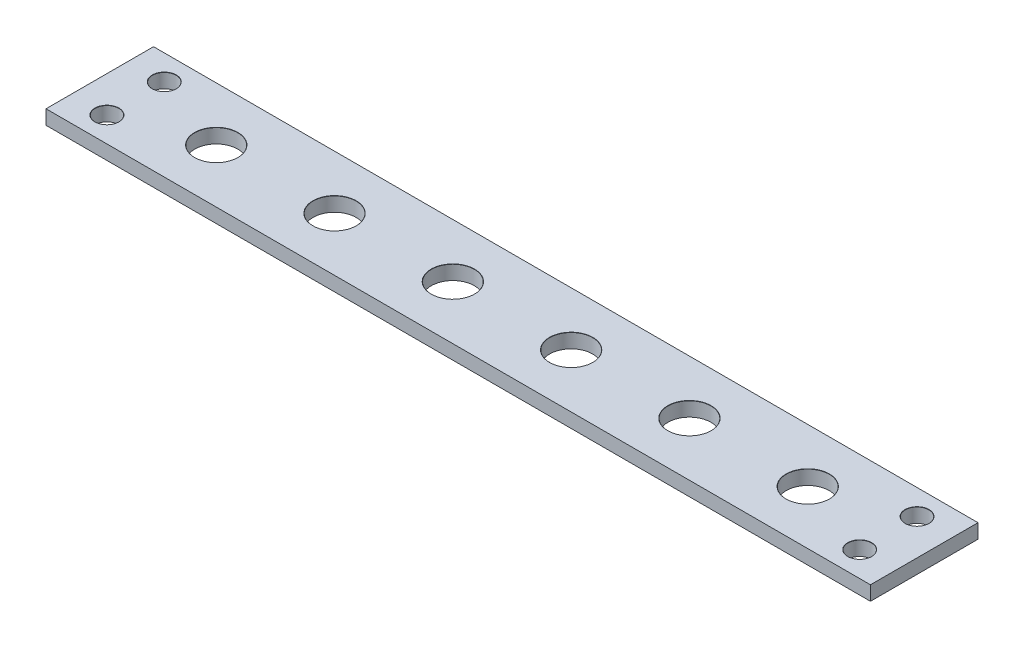
ISO-10303-21;
HEADER;
FILE_DESCRIPTION(('STEP AP214'),'2;1');
FILE_NAME('part.step','',(''),(''),'','','');
FILE_SCHEMA(('AUTOMOTIVE_DESIGN { 1 0 10303 214 1 1 1 1 }'));
ENDSEC;
DATA;
#1=APPLICATION_CONTEXT('core data for automotive mechanical design processes');
#2=APPLICATION_PROTOCOL_DEFINITION('international standard','automotive_design',2000,#1);
#3=PRODUCT_CONTEXT('',#1,'mechanical');
#4=PRODUCT('Part','Part','',(#3));
#5=PRODUCT_RELATED_PRODUCT_CATEGORY('part','',(#4));
#6=PRODUCT_DEFINITION_FORMATION('','',#4);
#7=PRODUCT_DEFINITION_CONTEXT('part definition',#1,'design');
#8=PRODUCT_DEFINITION('design','',#6,#7);
#9=PRODUCT_DEFINITION_SHAPE('','',#8);
#10=(LENGTH_UNIT() NAMED_UNIT(*) SI_UNIT(.MILLI.,.METRE.));
#11=(NAMED_UNIT(*) PLANE_ANGLE_UNIT() SI_UNIT($,.RADIAN.));
#12=(NAMED_UNIT(*) SI_UNIT($,.STERADIAN.) SOLID_ANGLE_UNIT());
#13=UNCERTAINTY_MEASURE_WITH_UNIT(LENGTH_MEASURE(1.E-05),#10,'distance_accuracy_value','');
#14=(GEOMETRIC_REPRESENTATION_CONTEXT(3) GLOBAL_UNCERTAINTY_ASSIGNED_CONTEXT((#13)) GLOBAL_UNIT_ASSIGNED_CONTEXT((#10,
#11,#12)) REPRESENTATION_CONTEXT('',''));
#15=CARTESIAN_POINT('',(0.,0.,0.));
#16=DIRECTION('',(0.,0.,1.));
#17=DIRECTION('',(1.,0.,0.));
#18=AXIS2_PLACEMENT_3D('',#15,#16,#17);
#19=CARTESIAN_POINT('',(57.5,2.,-7.5));
#20=DIRECTION('',(-1.,0.,0.));
#21=DIRECTION('',(0.,0.,1.));
#22=AXIS2_PLACEMENT_3D('',#19,#20,#21);
#23=PLANE('',#22);
#24=DIRECTION('',(0.,0.,-1.));
#25=VECTOR('',#24,1.);
#26=CARTESIAN_POINT('',(57.5,0.,-7.5));
#27=LINE('',#26,#25);
#28=CARTESIAN_POINT('',(57.5,0.,7.5));
#29=VERTEX_POINT('',#28);
#30=CARTESIAN_POINT('',(57.5,0.,-7.5));
#31=VERTEX_POINT('',#30);
#32=EDGE_CURVE('E98',#29,#31,#27,.T.);
#33=ORIENTED_EDGE('',*,*,#32,.T.);
#34=DIRECTION('',(0.,-1.,0.));
#35=VECTOR('',#34,1.);
#36=CARTESIAN_POINT('',(57.5,2.,-7.5));
#37=LINE('',#36,#35);
#38=CARTESIAN_POINT('',(57.5,2.,-7.5));
#39=VERTEX_POINT('',#38);
#40=EDGE_CURVE('E11',#39,#31,#37,.T.);
#41=ORIENTED_EDGE('',*,*,#40,.F.);
#42=DIRECTION('',(0.,0.,-1.));
#43=VECTOR('',#42,1.);
#44=CARTESIAN_POINT('',(57.5,2.,-7.5));
#45=LINE('',#44,#43);
#46=CARTESIAN_POINT('',(57.5,2.,7.5));
#47=VERTEX_POINT('',#46);
#48=EDGE_CURVE('E85',#47,#39,#45,.T.);
#49=ORIENTED_EDGE('',*,*,#48,.F.);
#50=DIRECTION('',(0.,-1.,0.));
#51=VECTOR('',#50,1.);
#52=CARTESIAN_POINT('',(57.5,2.,7.5));
#53=LINE('',#52,#51);
#54=EDGE_CURVE('E94',#47,#29,#53,.T.);
#55=ORIENTED_EDGE('',*,*,#54,.T.);
#56=EDGE_LOOP('',(#33,#41,#49,#55));
#57=FACE_BOUND('',#56,.T.);
#58=ADVANCED_FACE('F32',(#57),#23,.F.);
#59=CARTESIAN_POINT('',(-57.5,2.,-7.5));
#60=DIRECTION('',(0.,0.,1.));
#61=DIRECTION('',(1.,0.,0.));
#62=AXIS2_PLACEMENT_3D('',#59,#60,#61);
#63=PLANE('',#62);
#64=DIRECTION('',(-1.,0.,0.));
#65=VECTOR('',#64,1.);
#66=CARTESIAN_POINT('',(-57.5,0.,-7.5));
#67=LINE('',#66,#65);
#68=CARTESIAN_POINT('',(-57.5,0.,-7.5));
#69=VERTEX_POINT('',#68);
#70=EDGE_CURVE('E89',#31,#69,#67,.T.);
#71=ORIENTED_EDGE('',*,*,#70,.T.);
#72=DIRECTION('',(0.,-1.,0.));
#73=VECTOR('',#72,1.);
#74=CARTESIAN_POINT('',(-57.5,2.,-7.5));
#75=LINE('',#74,#73);
#76=CARTESIAN_POINT('',(-57.5,2.,-7.5));
#77=VERTEX_POINT('',#76);
#78=EDGE_CURVE('E41',#77,#69,#75,.T.);
#79=ORIENTED_EDGE('',*,*,#78,.F.);
#80=DIRECTION('',(-1.,0.,0.));
#81=VECTOR('',#80,1.);
#82=CARTESIAN_POINT('',(-57.5,2.,-7.5));
#83=LINE('',#82,#81);
#84=EDGE_CURVE('E80',#39,#77,#83,.T.);
#85=ORIENTED_EDGE('',*,*,#84,.F.);
#86=ORIENTED_EDGE('',*,*,#40,.T.);
#87=EDGE_LOOP('',(#71,#79,#85,#86));
#88=FACE_BOUND('',#87,.T.);
#89=ADVANCED_FACE('F88',(#88),#63,.F.);
#90=CARTESIAN_POINT('',(-57.5,2.,-7.5));
#91=DIRECTION('',(1.,0.,0.));
#92=DIRECTION('',(0.,0.,-1.));
#93=AXIS2_PLACEMENT_3D('',#90,#91,#92);
#94=PLANE('',#93);
#95=DIRECTION('',(0.,0.,1.));
#96=VECTOR('',#95,1.);
#97=CARTESIAN_POINT('',(-57.5,0.,-7.5));
#98=LINE('',#97,#96);
#99=CARTESIAN_POINT('',(-57.5,0.,7.5));
#100=VERTEX_POINT('',#99);
#101=EDGE_CURVE('E67',#69,#100,#98,.T.);
#102=ORIENTED_EDGE('',*,*,#101,.T.);
#103=DIRECTION('',(0.,-1.,0.));
#104=VECTOR('',#103,1.);
#105=CARTESIAN_POINT('',(-57.5,2.,7.5));
#106=LINE('',#105,#104);
#107=CARTESIAN_POINT('',(-57.5,2.,7.5));
#108=VERTEX_POINT('',#107);
#109=EDGE_CURVE('E90',#108,#100,#106,.T.);
#110=ORIENTED_EDGE('',*,*,#109,.F.);
#111=DIRECTION('',(0.,0.,1.));
#112=VECTOR('',#111,1.);
#113=CARTESIAN_POINT('',(-57.5,2.,-7.5));
#114=LINE('',#113,#112);
#115=EDGE_CURVE('E83',#77,#108,#114,.T.);
#116=ORIENTED_EDGE('',*,*,#115,.F.);
#117=ORIENTED_EDGE('',*,*,#78,.T.);
#118=EDGE_LOOP('',(#102,#110,#116,#117));
#119=FACE_BOUND('',#118,.T.);
#120=ADVANCED_FACE('F92',(#119),#94,.F.);
#121=CARTESIAN_POINT('',(-57.5,2.,7.5));
#122=DIRECTION('',(0.,0.,-1.));
#123=DIRECTION('',(-1.,0.,0.));
#124=AXIS2_PLACEMENT_3D('',#121,#122,#123);
#125=PLANE('',#124);
#126=DIRECTION('',(1.,0.,0.));
#127=VECTOR('',#126,1.);
#128=CARTESIAN_POINT('',(-57.5,0.,7.5));
#129=LINE('',#128,#127);
#130=EDGE_CURVE('E73',#100,#29,#129,.T.);
#131=ORIENTED_EDGE('',*,*,#130,.T.);
#132=ORIENTED_EDGE('',*,*,#54,.F.);
#133=DIRECTION('',(1.,0.,0.));
#134=VECTOR('',#133,1.);
#135=CARTESIAN_POINT('',(-57.5,2.,7.5));
#136=LINE('',#135,#134);
#137=EDGE_CURVE('E50',#108,#47,#136,.T.);
#138=ORIENTED_EDGE('',*,*,#137,.F.);
#139=ORIENTED_EDGE('',*,*,#109,.T.);
#140=EDGE_LOOP('',(#131,#132,#138,#139));
#141=FACE_BOUND('',#140,.T.);
#142=ADVANCED_FACE('F204',(#141),#125,.F.);
#143=CARTESIAN_POINT('',(0.,2.,0.));
#144=DIRECTION('',(0.,1.,0.));
#145=DIRECTION('',(0.,0.,1.));
#146=AXIS2_PLACEMENT_3D('',#143,#144,#145);
#147=PLANE('',#146);
#148=CARTESIAN_POINT('',(-8.25,2.,0.));
#149=DIRECTION('',(0.,1.,0.));
#150=DIRECTION('',(0.,0.,1.));
#151=AXIS2_PLACEMENT_3D('',#148,#149,#150);
#152=CIRCLE('',#151,3.025);
#153=CARTESIAN_POINT('',(-8.25,2.,3.025));
#154=VERTEX_POINT('',#153);
#155=EDGE_CURVE('E444',#154,#154,#152,.T.);
#156=ORIENTED_EDGE('',*,*,#155,.F.);
#157=EDGE_LOOP('',(#156));
#158=FACE_BOUND('',#157,.T.);
#159=CARTESIAN_POINT('',(8.25,2.,0.));
#160=DIRECTION('',(0.,1.,0.));
#161=DIRECTION('',(0.,0.,1.));
#162=AXIS2_PLACEMENT_3D('',#159,#160,#161);
#163=CIRCLE('',#162,3.025);
#164=CARTESIAN_POINT('',(8.25,2.,3.025));
#165=VERTEX_POINT('',#164);
#166=EDGE_CURVE('E153',#165,#165,#163,.T.);
#167=ORIENTED_EDGE('',*,*,#166,.F.);
#168=EDGE_LOOP('',(#167));
#169=FACE_BOUND('',#168,.T.);
#170=CARTESIAN_POINT('',(24.75,2.,0.));
#171=DIRECTION('',(0.,1.,0.));
#172=DIRECTION('',(0.,0.,1.));
#173=AXIS2_PLACEMENT_3D('',#170,#171,#172);
#174=CIRCLE('',#173,3.025);
#175=CARTESIAN_POINT('',(24.75,2.,3.025));
#176=VERTEX_POINT('',#175);
#177=EDGE_CURVE('E146',#176,#176,#174,.T.);
#178=ORIENTED_EDGE('',*,*,#177,.F.);
#179=EDGE_LOOP('',(#178));
#180=FACE_BOUND('',#179,.T.);
#181=CARTESIAN_POINT('',(41.25,2.,0.));
#182=DIRECTION('',(0.,1.,0.));
#183=DIRECTION('',(0.,0.,1.));
#184=AXIS2_PLACEMENT_3D('',#181,#182,#183);
#185=CIRCLE('',#184,3.025);
#186=CARTESIAN_POINT('',(41.25,2.,3.025));
#187=VERTEX_POINT('',#186);
#188=EDGE_CURVE('E142',#187,#187,#185,.T.);
#189=ORIENTED_EDGE('',*,*,#188,.F.);
#190=EDGE_LOOP('',(#189));
#191=FACE_BOUND('',#190,.T.);
#192=CARTESIAN_POINT('',(-24.75,2.,0.));
#193=DIRECTION('',(0.,1.,0.));
#194=DIRECTION('',(0.,0.,1.));
#195=AXIS2_PLACEMENT_3D('',#192,#193,#194);
#196=CIRCLE('',#195,3.025);
#197=CARTESIAN_POINT('',(-24.75,2.,3.02500000000001));
#198=VERTEX_POINT('',#197);
#199=EDGE_CURVE('E138',#198,#198,#196,.T.);
#200=ORIENTED_EDGE('',*,*,#199,.F.);
#201=EDGE_LOOP('',(#200));
#202=FACE_BOUND('',#201,.T.);
#203=CARTESIAN_POINT('',(-41.25,2.,0.));
#204=DIRECTION('',(0.,1.,0.));
#205=DIRECTION('',(0.,0.,1.));
#206=AXIS2_PLACEMENT_3D('',#203,#204,#205);
#207=CIRCLE('',#206,3.025);
#208=CARTESIAN_POINT('',(-41.25,2.,3.02500000000001));
#209=VERTEX_POINT('',#208);
#210=EDGE_CURVE('E133',#209,#209,#207,.T.);
#211=ORIENTED_EDGE('',*,*,#210,.F.);
#212=EDGE_LOOP('',(#211));
#213=FACE_BOUND('',#212,.T.);
#214=CARTESIAN_POINT('',(-52.5,2.,-4.));
#215=DIRECTION('',(0.,1.,0.));
#216=DIRECTION('',(0.,0.,1.));
#217=AXIS2_PLACEMENT_3D('',#214,#215,#216);
#218=CIRCLE('',#217,1.675);
#219=CARTESIAN_POINT('',(-52.5,2.,-2.325));
#220=VERTEX_POINT('',#219);
#221=EDGE_CURVE('E128',#220,#220,#218,.T.);
#222=ORIENTED_EDGE('',*,*,#221,.F.);
#223=EDGE_LOOP('',(#222));
#224=FACE_BOUND('',#223,.T.);
#225=CARTESIAN_POINT('',(-52.5,2.,4.));
#226=DIRECTION('',(0.,1.,0.));
#227=DIRECTION('',(0.,0.,1.));
#228=AXIS2_PLACEMENT_3D('',#225,#226,#227);
#229=CIRCLE('',#228,1.675);
#230=CARTESIAN_POINT('',(-52.5,2.,5.675));
#231=VERTEX_POINT('',#230);
#232=EDGE_CURVE('E123',#231,#231,#229,.T.);
#233=ORIENTED_EDGE('',*,*,#232,.F.);
#234=EDGE_LOOP('',(#233));
#235=FACE_BOUND('',#234,.T.);
#236=CARTESIAN_POINT('',(52.5,2.,-4.));
#237=DIRECTION('',(0.,1.,0.));
#238=DIRECTION('',(0.,0.,1.));
#239=AXIS2_PLACEMENT_3D('',#236,#237,#238);
#240=CIRCLE('',#239,1.675);
#241=CARTESIAN_POINT('',(52.5,2.,-2.325));
#242=VERTEX_POINT('',#241);
#243=EDGE_CURVE('E118',#242,#242,#240,.T.);
#244=ORIENTED_EDGE('',*,*,#243,.F.);
#245=EDGE_LOOP('',(#244));
#246=FACE_BOUND('',#245,.T.);
#247=CARTESIAN_POINT('',(52.5,2.,4.));
#248=DIRECTION('',(0.,1.,0.));
#249=DIRECTION('',(0.,0.,1.));
#250=AXIS2_PLACEMENT_3D('',#247,#248,#249);
#251=CIRCLE('',#250,1.675);
#252=CARTESIAN_POINT('',(52.5,2.,5.675));
#253=VERTEX_POINT('',#252);
#254=EDGE_CURVE('E113',#253,#253,#251,.T.);
#255=ORIENTED_EDGE('',*,*,#254,.F.);
#256=EDGE_LOOP('',(#255));
#257=FACE_BOUND('',#256,.T.);
#258=ORIENTED_EDGE('',*,*,#48,.T.);
#259=ORIENTED_EDGE('',*,*,#84,.T.);
#260=ORIENTED_EDGE('',*,*,#115,.T.);
#261=ORIENTED_EDGE('',*,*,#137,.T.);
#262=EDGE_LOOP('',(#258,#259,#260,#261));
#263=FACE_BOUND('',#262,.T.);
#264=ADVANCED_FACE('F81',(#158,#169,#180,#191,#202,#213,#224,#235,#246,#257,#263),#147,.T.);
#265=CARTESIAN_POINT('',(0.,0.,0.));
#266=DIRECTION('',(0.,1.,0.));
#267=DIRECTION('',(0.,0.,1.));
#268=AXIS2_PLACEMENT_3D('',#265,#266,#267);
#269=PLANE('',#268);
#270=CARTESIAN_POINT('',(-8.25,0.,0.));
#271=DIRECTION('',(0.,1.,0.));
#272=DIRECTION('',(0.,0.,1.));
#273=AXIS2_PLACEMENT_3D('',#270,#271,#272);
#274=CIRCLE('',#273,3.);
#275=CARTESIAN_POINT('',(-8.25,0.,3.));
#276=VERTEX_POINT('',#275);
#277=EDGE_CURVE('E35',#276,#276,#274,.T.);
#278=ORIENTED_EDGE('',*,*,#277,.T.);
#279=EDGE_LOOP('',(#278));
#280=FACE_BOUND('',#279,.T.);
#281=CARTESIAN_POINT('',(8.25,0.,0.));
#282=DIRECTION('',(0.,1.,0.));
#283=DIRECTION('',(0.,0.,1.));
#284=AXIS2_PLACEMENT_3D('',#281,#282,#283);
#285=CIRCLE('',#284,3.);
#286=CARTESIAN_POINT('',(8.25,0.,3.));
#287=VERTEX_POINT('',#286);
#288=EDGE_CURVE('E144',#287,#287,#285,.T.);
#289=ORIENTED_EDGE('',*,*,#288,.T.);
#290=EDGE_LOOP('',(#289));
#291=FACE_BOUND('',#290,.T.);
#292=CARTESIAN_POINT('',(24.75,0.,0.));
#293=DIRECTION('',(0.,1.,0.));
#294=DIRECTION('',(0.,0.,1.));
#295=AXIS2_PLACEMENT_3D('',#292,#293,#294);
#296=CIRCLE('',#295,3.);
#297=CARTESIAN_POINT('',(24.75,0.,3.));
#298=VERTEX_POINT('',#297);
#299=EDGE_CURVE('E140',#298,#298,#296,.T.);
#300=ORIENTED_EDGE('',*,*,#299,.T.);
#301=EDGE_LOOP('',(#300));
#302=FACE_BOUND('',#301,.T.);
#303=CARTESIAN_POINT('',(41.25,0.,0.));
#304=DIRECTION('',(0.,1.,0.));
#305=DIRECTION('',(0.,0.,1.));
#306=AXIS2_PLACEMENT_3D('',#303,#304,#305);
#307=CIRCLE('',#306,3.);
#308=CARTESIAN_POINT('',(41.25,0.,3.));
#309=VERTEX_POINT('',#308);
#310=EDGE_CURVE('E135',#309,#309,#307,.T.);
#311=ORIENTED_EDGE('',*,*,#310,.T.);
#312=EDGE_LOOP('',(#311));
#313=FACE_BOUND('',#312,.T.);
#314=CARTESIAN_POINT('',(-24.75,0.,0.));
#315=DIRECTION('',(0.,1.,0.));
#316=DIRECTION('',(0.,0.,1.));
#317=AXIS2_PLACEMENT_3D('',#314,#315,#316);
#318=CIRCLE('',#317,3.);
#319=CARTESIAN_POINT('',(-24.75,0.,3.));
#320=VERTEX_POINT('',#319);
#321=EDGE_CURVE('E130',#320,#320,#318,.T.);
#322=ORIENTED_EDGE('',*,*,#321,.T.);
#323=EDGE_LOOP('',(#322));
#324=FACE_BOUND('',#323,.T.);
#325=CARTESIAN_POINT('',(-41.25,0.,0.));
#326=DIRECTION('',(0.,1.,0.));
#327=DIRECTION('',(0.,0.,1.));
#328=AXIS2_PLACEMENT_3D('',#325,#326,#327);
#329=CIRCLE('',#328,3.);
#330=CARTESIAN_POINT('',(-41.25,0.,3.00000000000001));
#331=VERTEX_POINT('',#330);
#332=EDGE_CURVE('E125',#331,#331,#329,.T.);
#333=ORIENTED_EDGE('',*,*,#332,.T.);
#334=EDGE_LOOP('',(#333));
#335=FACE_BOUND('',#334,.T.);
#336=CARTESIAN_POINT('',(-52.5,0.,-4.));
#337=DIRECTION('',(0.,1.,0.));
#338=DIRECTION('',(0.,0.,1.));
#339=AXIS2_PLACEMENT_3D('',#336,#337,#338);
#340=CIRCLE('',#339,1.65);
#341=CARTESIAN_POINT('',(-52.5,0.,-2.35));
#342=VERTEX_POINT('',#341);
#343=EDGE_CURVE('E120',#342,#342,#340,.T.);
#344=ORIENTED_EDGE('',*,*,#343,.T.);
#345=EDGE_LOOP('',(#344));
#346=FACE_BOUND('',#345,.T.);
#347=CARTESIAN_POINT('',(-52.5,0.,4.));
#348=DIRECTION('',(0.,1.,0.));
#349=DIRECTION('',(0.,0.,1.));
#350=AXIS2_PLACEMENT_3D('',#347,#348,#349);
#351=CIRCLE('',#350,1.65);
#352=CARTESIAN_POINT('',(-52.5,0.,5.65));
#353=VERTEX_POINT('',#352);
#354=EDGE_CURVE('E115',#353,#353,#351,.T.);
#355=ORIENTED_EDGE('',*,*,#354,.T.);
#356=EDGE_LOOP('',(#355));
#357=FACE_BOUND('',#356,.T.);
#358=CARTESIAN_POINT('',(52.5,0.,-4.));
#359=DIRECTION('',(0.,1.,0.));
#360=DIRECTION('',(0.,0.,1.));
#361=AXIS2_PLACEMENT_3D('',#358,#359,#360);
#362=CIRCLE('',#361,1.65);
#363=CARTESIAN_POINT('',(52.5,0.,-2.35));
#364=VERTEX_POINT('',#363);
#365=EDGE_CURVE('E110',#364,#364,#362,.T.);
#366=ORIENTED_EDGE('',*,*,#365,.T.);
#367=EDGE_LOOP('',(#366));
#368=FACE_BOUND('',#367,.T.);
#369=CARTESIAN_POINT('',(52.5,0.,4.));
#370=DIRECTION('',(0.,1.,0.));
#371=DIRECTION('',(0.,0.,1.));
#372=AXIS2_PLACEMENT_3D('',#369,#370,#371);
#373=CIRCLE('',#372,1.65);
#374=CARTESIAN_POINT('',(52.5,0.,5.65));
#375=VERTEX_POINT('',#374);
#376=EDGE_CURVE('E101',#375,#375,#373,.T.);
#377=ORIENTED_EDGE('',*,*,#376,.T.);
#378=EDGE_LOOP('',(#377));
#379=FACE_BOUND('',#378,.T.);
#380=ORIENTED_EDGE('',*,*,#32,.F.);
#381=ORIENTED_EDGE('',*,*,#130,.F.);
#382=ORIENTED_EDGE('',*,*,#101,.F.);
#383=ORIENTED_EDGE('',*,*,#70,.F.);
#384=EDGE_LOOP('',(#380,#381,#382,#383));
#385=FACE_BOUND('',#384,.T.);
#386=ADVANCED_FACE('F203',(#280,#291,#302,#313,#324,#335,#346,#357,#368,#379,#385),#269,.F.);
#387=CARTESIAN_POINT('',(52.5,2.,4.));
#388=DIRECTION('',(0.,1.,0.));
#389=DIRECTION('',(0.,0.,1.));
#390=AXIS2_PLACEMENT_3D('',#387,#388,#389);
#391=CYLINDRICAL_SURFACE('',#390,1.65);
#392=CARTESIAN_POINT('',(52.5,1.975,4.));
#393=DIRECTION('',(0.,1.,0.));
#394=DIRECTION('',(0.,0.,1.));
#395=AXIS2_PLACEMENT_3D('',#392,#393,#394);
#396=CIRCLE('',#395,1.65);
#397=CARTESIAN_POINT('',(52.5,1.975,5.65));
#398=VERTEX_POINT('',#397);
#399=EDGE_CURVE('E109',#398,#398,#396,.T.);
#400=ORIENTED_EDGE('',*,*,#399,.T.);
#401=EDGE_LOOP('',(#400));
#402=FACE_BOUND('',#401,.T.);
#403=ORIENTED_EDGE('',*,*,#376,.F.);
#404=EDGE_LOOP('',(#403));
#405=FACE_BOUND('',#404,.T.);
#406=ADVANCED_FACE('F192',(#402,#405),#391,.F.);
#407=CARTESIAN_POINT('',(52.5,2.,4.));
#408=DIRECTION('',(0.,1.,0.));
#409=DIRECTION('',(0.,0.,1.));
#410=AXIS2_PLACEMENT_3D('',#407,#408,#409);
#411=CONICAL_SURFACE('',#410,1.675,0.785398163397518);
#412=ORIENTED_EDGE('',*,*,#399,.F.);
#413=EDGE_LOOP('',(#412));
#414=FACE_BOUND('',#413,.T.);
#415=ORIENTED_EDGE('',*,*,#254,.T.);
#416=EDGE_LOOP('',(#415));
#417=FACE_BOUND('',#416,.T.);
#418=ADVANCED_FACE('F195',(#414,#417),#411,.F.);
#419=CARTESIAN_POINT('',(52.5,2.,-4.));
#420=DIRECTION('',(0.,1.,0.));
#421=DIRECTION('',(0.,0.,1.));
#422=AXIS2_PLACEMENT_3D('',#419,#420,#421);
#423=CYLINDRICAL_SURFACE('',#422,1.65);
#424=CARTESIAN_POINT('',(52.5,1.975,-4.));
#425=DIRECTION('',(0.,1.,0.));
#426=DIRECTION('',(0.,0.,1.));
#427=AXIS2_PLACEMENT_3D('',#424,#425,#426);
#428=CIRCLE('',#427,1.65);
#429=CARTESIAN_POINT('',(52.5,1.975,-2.35));
#430=VERTEX_POINT('',#429);
#431=EDGE_CURVE('E114',#430,#430,#428,.T.);
#432=ORIENTED_EDGE('',*,*,#431,.T.);
#433=EDGE_LOOP('',(#432));
#434=FACE_BOUND('',#433,.T.);
#435=ORIENTED_EDGE('',*,*,#365,.F.);
#436=EDGE_LOOP('',(#435));
#437=FACE_BOUND('',#436,.T.);
#438=ADVANCED_FACE('F198',(#434,#437),#423,.F.);
#439=CARTESIAN_POINT('',(52.5,2.,-4.));
#440=DIRECTION('',(0.,1.,0.));
#441=DIRECTION('',(0.,0.,1.));
#442=AXIS2_PLACEMENT_3D('',#439,#440,#441);
#443=CONICAL_SURFACE('',#442,1.675,0.785398163397518);
#444=ORIENTED_EDGE('',*,*,#431,.F.);
#445=EDGE_LOOP('',(#444));
#446=FACE_BOUND('',#445,.T.);
#447=ORIENTED_EDGE('',*,*,#243,.T.);
#448=EDGE_LOOP('',(#447));
#449=FACE_BOUND('',#448,.T.);
#450=ADVANCED_FACE('F258',(#446,#449),#443,.F.);
#451=CARTESIAN_POINT('',(-52.5,2.,4.));
#452=DIRECTION('',(0.,1.,0.));
#453=DIRECTION('',(0.,0.,1.));
#454=AXIS2_PLACEMENT_3D('',#451,#452,#453);
#455=CYLINDRICAL_SURFACE('',#454,1.65);
#456=CARTESIAN_POINT('',(-52.5,1.975,4.));
#457=DIRECTION('',(0.,1.,0.));
#458=DIRECTION('',(0.,0.,1.));
#459=AXIS2_PLACEMENT_3D('',#456,#457,#458);
#460=CIRCLE('',#459,1.65);
#461=CARTESIAN_POINT('',(-52.5,1.975,5.65));
#462=VERTEX_POINT('',#461);
#463=EDGE_CURVE('E119',#462,#462,#460,.T.);
#464=ORIENTED_EDGE('',*,*,#463,.T.);
#465=EDGE_LOOP('',(#464));
#466=FACE_BOUND('',#465,.T.);
#467=ORIENTED_EDGE('',*,*,#354,.F.);
#468=EDGE_LOOP('',(#467));
#469=FACE_BOUND('',#468,.T.);
#470=ADVANCED_FACE('F268',(#466,#469),#455,.F.);
#471=CARTESIAN_POINT('',(-52.5,2.,4.));
#472=DIRECTION('',(0.,1.,0.));
#473=DIRECTION('',(0.,0.,1.));
#474=AXIS2_PLACEMENT_3D('',#471,#472,#473);
#475=CONICAL_SURFACE('',#474,1.675,0.785398163397518);
#476=ORIENTED_EDGE('',*,*,#463,.F.);
#477=EDGE_LOOP('',(#476));
#478=FACE_BOUND('',#477,.T.);
#479=ORIENTED_EDGE('',*,*,#232,.T.);
#480=EDGE_LOOP('',(#479));
#481=FACE_BOUND('',#480,.T.);
#482=ADVANCED_FACE('F278',(#478,#481),#475,.F.);
#483=CARTESIAN_POINT('',(-52.5,2.,-4.));
#484=DIRECTION('',(0.,1.,0.));
#485=DIRECTION('',(0.,0.,1.));
#486=AXIS2_PLACEMENT_3D('',#483,#484,#485);
#487=CYLINDRICAL_SURFACE('',#486,1.65);
#488=CARTESIAN_POINT('',(-52.5,1.975,-4.));
#489=DIRECTION('',(0.,1.,0.));
#490=DIRECTION('',(0.,0.,1.));
#491=AXIS2_PLACEMENT_3D('',#488,#489,#490);
#492=CIRCLE('',#491,1.65);
#493=CARTESIAN_POINT('',(-52.5,1.975,-2.35));
#494=VERTEX_POINT('',#493);
#495=EDGE_CURVE('E124',#494,#494,#492,.T.);
#496=ORIENTED_EDGE('',*,*,#495,.T.);
#497=EDGE_LOOP('',(#496));
#498=FACE_BOUND('',#497,.T.);
#499=ORIENTED_EDGE('',*,*,#343,.F.);
#500=EDGE_LOOP('',(#499));
#501=FACE_BOUND('',#500,.T.);
#502=ADVANCED_FACE('F288',(#498,#501),#487,.F.);
#503=CARTESIAN_POINT('',(-52.5,2.,-4.));
#504=DIRECTION('',(0.,1.,0.));
#505=DIRECTION('',(0.,0.,1.));
#506=AXIS2_PLACEMENT_3D('',#503,#504,#505);
#507=CONICAL_SURFACE('',#506,1.675,0.785398163397518);
#508=ORIENTED_EDGE('',*,*,#495,.F.);
#509=EDGE_LOOP('',(#508));
#510=FACE_BOUND('',#509,.T.);
#511=ORIENTED_EDGE('',*,*,#221,.T.);
#512=EDGE_LOOP('',(#511));
#513=FACE_BOUND('',#512,.T.);
#514=ADVANCED_FACE('F298',(#510,#513),#507,.F.);
#515=CARTESIAN_POINT('',(-41.25,2.,0.));
#516=DIRECTION('',(0.,1.,0.));
#517=DIRECTION('',(0.,0.,1.));
#518=AXIS2_PLACEMENT_3D('',#515,#516,#517);
#519=CYLINDRICAL_SURFACE('',#518,3.);
#520=CARTESIAN_POINT('',(-41.25,1.975,0.));
#521=DIRECTION('',(0.,1.,0.));
#522=DIRECTION('',(0.,0.,1.));
#523=AXIS2_PLACEMENT_3D('',#520,#521,#522);
#524=CIRCLE('',#523,3.);
#525=CARTESIAN_POINT('',(-41.25,1.975,3.00000000000001));
#526=VERTEX_POINT('',#525);
#527=EDGE_CURVE('E129',#526,#526,#524,.T.);
#528=ORIENTED_EDGE('',*,*,#527,.T.);
#529=EDGE_LOOP('',(#528));
#530=FACE_BOUND('',#529,.T.);
#531=ORIENTED_EDGE('',*,*,#332,.F.);
#532=EDGE_LOOP('',(#531));
#533=FACE_BOUND('',#532,.T.);
#534=ADVANCED_FACE('F307',(#530,#533),#519,.F.);
#535=CARTESIAN_POINT('',(-41.25,2.,0.));
#536=DIRECTION('',(0.,1.,0.));
#537=DIRECTION('',(0.,0.,1.));
#538=AXIS2_PLACEMENT_3D('',#535,#536,#537);
#539=CONICAL_SURFACE('',#538,3.025,0.785398163397518);
#540=ORIENTED_EDGE('',*,*,#527,.F.);
#541=EDGE_LOOP('',(#540));
#542=FACE_BOUND('',#541,.T.);
#543=ORIENTED_EDGE('',*,*,#210,.T.);
#544=EDGE_LOOP('',(#543));
#545=FACE_BOUND('',#544,.T.);
#546=ADVANCED_FACE('F326',(#542,#545),#539,.F.);
#547=CARTESIAN_POINT('',(-24.75,2.,0.));
#548=DIRECTION('',(0.,1.,0.));
#549=DIRECTION('',(0.,0.,1.));
#550=AXIS2_PLACEMENT_3D('',#547,#548,#549);
#551=CYLINDRICAL_SURFACE('',#550,3.);
#552=CARTESIAN_POINT('',(-24.75,1.975,0.));
#553=DIRECTION('',(0.,1.,0.));
#554=DIRECTION('',(0.,0.,1.));
#555=AXIS2_PLACEMENT_3D('',#552,#553,#554);
#556=CIRCLE('',#555,3.);
#557=CARTESIAN_POINT('',(-24.75,1.975,3.00000000000001));
#558=VERTEX_POINT('',#557);
#559=EDGE_CURVE('E134',#558,#558,#556,.T.);
#560=ORIENTED_EDGE('',*,*,#559,.T.);
#561=EDGE_LOOP('',(#560));
#562=FACE_BOUND('',#561,.T.);
#563=ORIENTED_EDGE('',*,*,#321,.F.);
#564=EDGE_LOOP('',(#563));
#565=FACE_BOUND('',#564,.T.);
#566=ADVANCED_FACE('F336',(#562,#565),#551,.F.);
#567=CARTESIAN_POINT('',(-24.75,2.,0.));
#568=DIRECTION('',(0.,1.,0.));
#569=DIRECTION('',(0.,0.,1.));
#570=AXIS2_PLACEMENT_3D('',#567,#568,#569);
#571=CONICAL_SURFACE('',#570,3.025,0.785398163397448);
#572=ORIENTED_EDGE('',*,*,#559,.F.);
#573=EDGE_LOOP('',(#572));
#574=FACE_BOUND('',#573,.T.);
#575=ORIENTED_EDGE('',*,*,#199,.T.);
#576=EDGE_LOOP('',(#575));
#577=FACE_BOUND('',#576,.T.);
#578=ADVANCED_FACE('F346',(#574,#577),#571,.F.);
#579=CARTESIAN_POINT('',(41.25,2.,0.));
#580=DIRECTION('',(0.,1.,0.));
#581=DIRECTION('',(0.,0.,1.));
#582=AXIS2_PLACEMENT_3D('',#579,#580,#581);
#583=CYLINDRICAL_SURFACE('',#582,3.);
#584=CARTESIAN_POINT('',(41.25,1.975,0.));
#585=DIRECTION('',(0.,1.,0.));
#586=DIRECTION('',(0.,0.,1.));
#587=AXIS2_PLACEMENT_3D('',#584,#585,#586);
#588=CIRCLE('',#587,3.);
#589=CARTESIAN_POINT('',(41.25,1.975,3.));
#590=VERTEX_POINT('',#589);
#591=EDGE_CURVE('E139',#590,#590,#588,.T.);
#592=ORIENTED_EDGE('',*,*,#591,.T.);
#593=EDGE_LOOP('',(#592));
#594=FACE_BOUND('',#593,.T.);
#595=ORIENTED_EDGE('',*,*,#310,.F.);
#596=EDGE_LOOP('',(#595));
#597=FACE_BOUND('',#596,.T.);
#598=ADVANCED_FACE('F356',(#594,#597),#583,.F.);
#599=CARTESIAN_POINT('',(41.25,2.,0.));
#600=DIRECTION('',(0.,1.,0.));
#601=DIRECTION('',(0.,0.,1.));
#602=AXIS2_PLACEMENT_3D('',#599,#600,#601);
#603=CONICAL_SURFACE('',#602,3.025,0.785398163397518);
#604=ORIENTED_EDGE('',*,*,#591,.F.);
#605=EDGE_LOOP('',(#604));
#606=FACE_BOUND('',#605,.T.);
#607=ORIENTED_EDGE('',*,*,#188,.T.);
#608=EDGE_LOOP('',(#607));
#609=FACE_BOUND('',#608,.T.);
#610=ADVANCED_FACE('F366',(#606,#609),#603,.F.);
#611=CARTESIAN_POINT('',(24.75,2.,0.));
#612=DIRECTION('',(0.,1.,0.));
#613=DIRECTION('',(0.,0.,1.));
#614=AXIS2_PLACEMENT_3D('',#611,#612,#613);
#615=CYLINDRICAL_SURFACE('',#614,3.);
#616=CARTESIAN_POINT('',(24.75,1.975,0.));
#617=DIRECTION('',(0.,1.,0.));
#618=DIRECTION('',(0.,0.,1.));
#619=AXIS2_PLACEMENT_3D('',#616,#617,#618);
#620=CIRCLE('',#619,3.);
#621=CARTESIAN_POINT('',(24.75,1.975,3.));
#622=VERTEX_POINT('',#621);
#623=EDGE_CURVE('E143',#622,#622,#620,.T.);
#624=ORIENTED_EDGE('',*,*,#623,.T.);
#625=EDGE_LOOP('',(#624));
#626=FACE_BOUND('',#625,.T.);
#627=ORIENTED_EDGE('',*,*,#299,.F.);
#628=EDGE_LOOP('',(#627));
#629=FACE_BOUND('',#628,.T.);
#630=ADVANCED_FACE('F376',(#626,#629),#615,.F.);
#631=CARTESIAN_POINT('',(24.75,2.,0.));
#632=DIRECTION('',(0.,1.,0.));
#633=DIRECTION('',(0.,0.,1.));
#634=AXIS2_PLACEMENT_3D('',#631,#632,#633);
#635=CONICAL_SURFACE('',#634,3.025,0.785398163397448);
#636=ORIENTED_EDGE('',*,*,#623,.F.);
#637=EDGE_LOOP('',(#636));
#638=FACE_BOUND('',#637,.T.);
#639=ORIENTED_EDGE('',*,*,#177,.T.);
#640=EDGE_LOOP('',(#639));
#641=FACE_BOUND('',#640,.T.);
#642=ADVANCED_FACE('F386',(#638,#641),#635,.F.);
#643=CARTESIAN_POINT('',(8.25,2.,0.));
#644=DIRECTION('',(0.,1.,0.));
#645=DIRECTION('',(0.,0.,1.));
#646=AXIS2_PLACEMENT_3D('',#643,#644,#645);
#647=CYLINDRICAL_SURFACE('',#646,3.);
#648=CARTESIAN_POINT('',(8.25,1.975,0.));
#649=DIRECTION('',(0.,1.,0.));
#650=DIRECTION('',(0.,0.,1.));
#651=AXIS2_PLACEMENT_3D('',#648,#649,#650);
#652=CIRCLE('',#651,3.);
#653=CARTESIAN_POINT('',(8.25,1.975,3.));
#654=VERTEX_POINT('',#653);
#655=EDGE_CURVE('E147',#654,#654,#652,.T.);
#656=ORIENTED_EDGE('',*,*,#655,.T.);
#657=EDGE_LOOP('',(#656));
#658=FACE_BOUND('',#657,.T.);
#659=ORIENTED_EDGE('',*,*,#288,.F.);
#660=EDGE_LOOP('',(#659));
#661=FACE_BOUND('',#660,.T.);
#662=ADVANCED_FACE('F396',(#658,#661),#647,.F.);
#663=CARTESIAN_POINT('',(8.25,2.,0.));
#664=DIRECTION('',(0.,1.,0.));
#665=DIRECTION('',(0.,0.,1.));
#666=AXIS2_PLACEMENT_3D('',#663,#664,#665);
#667=CONICAL_SURFACE('',#666,3.025,0.785398163397448);
#668=ORIENTED_EDGE('',*,*,#655,.F.);
#669=EDGE_LOOP('',(#668));
#670=FACE_BOUND('',#669,.T.);
#671=ORIENTED_EDGE('',*,*,#166,.T.);
#672=EDGE_LOOP('',(#671));
#673=FACE_BOUND('',#672,.T.);
#674=ADVANCED_FACE('F406',(#670,#673),#667,.F.);
#675=CARTESIAN_POINT('',(-8.25,2.,0.));
#676=DIRECTION('',(0.,1.,0.));
#677=DIRECTION('',(0.,0.,1.));
#678=AXIS2_PLACEMENT_3D('',#675,#676,#677);
#679=CYLINDRICAL_SURFACE('',#678,3.);
#680=CARTESIAN_POINT('',(-8.25,1.975,0.));
#681=DIRECTION('',(0.,1.,0.));
#682=DIRECTION('',(0.,0.,1.));
#683=AXIS2_PLACEMENT_3D('',#680,#681,#682);
#684=CIRCLE('',#683,3.);
#685=CARTESIAN_POINT('',(-8.25,1.975,3.));
#686=VERTEX_POINT('',#685);
#687=EDGE_CURVE('E442',#686,#686,#684,.T.);
#688=ORIENTED_EDGE('',*,*,#687,.T.);
#689=EDGE_LOOP('',(#688));
#690=FACE_BOUND('',#689,.T.);
#691=ORIENTED_EDGE('',*,*,#277,.F.);
#692=EDGE_LOOP('',(#691));
#693=FACE_BOUND('',#692,.T.);
#694=ADVANCED_FACE('F415',(#690,#693),#679,.F.);
#695=CARTESIAN_POINT('',(-8.25,2.,0.));
#696=DIRECTION('',(0.,1.,0.));
#697=DIRECTION('',(0.,0.,1.));
#698=AXIS2_PLACEMENT_3D('',#695,#696,#697);
#699=CONICAL_SURFACE('',#698,3.025,0.785398163397466);
#700=ORIENTED_EDGE('',*,*,#687,.F.);
#701=EDGE_LOOP('',(#700));
#702=FACE_BOUND('',#701,.T.);
#703=ORIENTED_EDGE('',*,*,#155,.T.);
#704=EDGE_LOOP('',(#703));
#705=FACE_BOUND('',#704,.T.);
#706=ADVANCED_FACE('F425',(#702,#705),#699,.F.);
#707=CLOSED_SHELL('',(#58,#89,#120,#142,#264,#386,#406,#418,#438,#450,#470,#482,#502,#514,#534,
#546,#566,#578,#598,#610,#630,#642,#662,#674,#694,#706));
#708=MANIFOLD_SOLID_BREP('B2',#707);
#709=ADVANCED_BREP_SHAPE_REPRESENTATION('',(#18,#708),#14);
#710=SHAPE_DEFINITION_REPRESENTATION(#9,#709);
ENDSEC;
END-ISO-10303-21;
